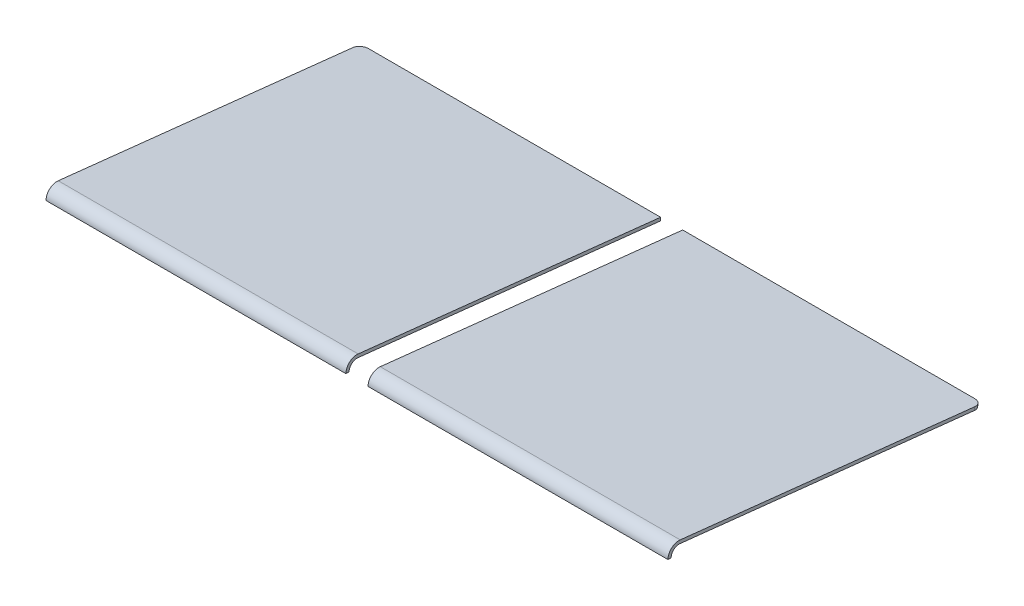
ISO-10303-21;
HEADER;
FILE_DESCRIPTION(('STEP AP214'),'2;1');
FILE_NAME('part.step','',(''),(''),'','','');
FILE_SCHEMA(('AUTOMOTIVE_DESIGN { 1 0 10303 214 1 1 1 1 }'));
ENDSEC;
DATA;
#1=APPLICATION_CONTEXT('core data for automotive mechanical design processes');
#2=APPLICATION_PROTOCOL_DEFINITION('international standard','automotive_design',2000,#1);
#3=PRODUCT_CONTEXT('',#1,'mechanical');
#4=PRODUCT('Part','Part','',(#3));
#5=PRODUCT_RELATED_PRODUCT_CATEGORY('part','',(#4));
#6=PRODUCT_DEFINITION_FORMATION('','',#4);
#7=PRODUCT_DEFINITION_CONTEXT('part definition',#1,'design');
#8=PRODUCT_DEFINITION('design','',#6,#7);
#9=PRODUCT_DEFINITION_SHAPE('','',#8);
#10=(LENGTH_UNIT() NAMED_UNIT(*) SI_UNIT(.MILLI.,.METRE.));
#11=(NAMED_UNIT(*) PLANE_ANGLE_UNIT() SI_UNIT($,.RADIAN.));
#12=(NAMED_UNIT(*) SI_UNIT($,.STERADIAN.) SOLID_ANGLE_UNIT());
#13=UNCERTAINTY_MEASURE_WITH_UNIT(LENGTH_MEASURE(1.E-05),#10,'distance_accuracy_value','');
#14=(GEOMETRIC_REPRESENTATION_CONTEXT(3) GLOBAL_UNCERTAINTY_ASSIGNED_CONTEXT((#13)) GLOBAL_UNIT_ASSIGNED_CONTEXT((#10,
#11,#12)) REPRESENTATION_CONTEXT('',''));
#15=CARTESIAN_POINT('',(0.,0.,0.));
#16=DIRECTION('',(0.,0.,1.));
#17=DIRECTION('',(1.,0.,0.));
#18=AXIS2_PLACEMENT_3D('',#15,#16,#17);
#19=CARTESIAN_POINT('',(362.,0.,0.));
#20=DIRECTION('',(1.,0.,0.));
#21=DIRECTION('',(0.,0.,-1.));
#22=AXIS2_PLACEMENT_3D('',#19,#20,#21);
#23=PLANE('',#22);
#24=DIRECTION('',(0.,0.,-1.));
#25=VECTOR('',#24,1.);
#26=CARTESIAN_POINT('',(362.,113.937005826671,37.4));
#27=LINE('',#26,#25);
#28=CARTESIAN_POINT('',(362.,113.937005826671,39.4));
#29=VERTEX_POINT('',#28);
#30=CARTESIAN_POINT('',(362.,113.937005826671,37.4));
#31=VERTEX_POINT('',#30);
#32=EDGE_CURVE('E162',#29,#31,#27,.T.);
#33=ORIENTED_EDGE('',*,*,#32,.T.);
#34=CARTESIAN_POINT('',(362.,113.937005826671,32.4));
#35=DIRECTION('',(1.,0.,0.));
#36=DIRECTION('',(0.,0.,-1.));
#37=AXIS2_PLACEMENT_3D('',#34,#35,#36);
#38=CIRCLE('',#37,5.00000000000001);
#39=CARTESIAN_POINT('',(362.,118.907830843486,31.8606497870554));
#40=VERTEX_POINT('',#39);
#41=EDGE_CURVE('E159',#40,#31,#38,.T.);
#42=ORIENTED_EDGE('',*,*,#41,.F.);
#43=DIRECTION('',(0.,0.107870042588919,0.994165003363056));
#44=VECTOR('',#43,1.);
#45=CARTESIAN_POINT('',(362.,100.,-142.4));
#46=LINE('',#45,#44);
#47=CARTESIAN_POINT('',(362.,98.6622549779722,-154.729088340045));
#48=VERTEX_POINT('',#47);
#49=EDGE_CURVE('E127',#48,#40,#46,.T.);
#50=ORIENTED_EDGE('',*,*,#49,.F.);
#51=DIRECTION('',(0.,-0.994165003363056,0.107870042588914));
#52=VECTOR('',#51,1.);
#53=CARTESIAN_POINT('',(362.,-15.4452148796673,-142.348067491777));
#54=LINE('',#53,#52);
#55=CARTESIAN_POINT('',(362.,100.650584984698,-154.944828425223));
#56=VERTEX_POINT('',#55);
#57=EDGE_CURVE('E123',#48,#56,#54,.F.);
#58=ORIENTED_EDGE('',*,*,#57,.T.);
#59=DIRECTION('',(0.,-0.107870042588919,-0.994165003363056));
#60=VECTOR('',#59,1.);
#61=CARTESIAN_POINT('',(362.,101.988330006726,-142.615740085178));
#62=LINE('',#61,#60);
#63=CARTESIAN_POINT('',(362.,120.896160850212,31.6449097018776));
#64=VERTEX_POINT('',#63);
#65=EDGE_CURVE('E148',#64,#56,#62,.T.);
#66=ORIENTED_EDGE('',*,*,#65,.F.);
#67=CARTESIAN_POINT('',(362.,113.937005826671,32.4));
#68=DIRECTION('',(1.,0.,0.));
#69=DIRECTION('',(0.,0.,-1.));
#70=AXIS2_PLACEMENT_3D('',#67,#68,#69);
#71=CIRCLE('',#70,7.00000000000001);
#72=EDGE_CURVE('E149',#29,#64,#71,.F.);
#73=ORIENTED_EDGE('',*,*,#72,.F.);
#74=EDGE_LOOP('',(#33,#42,#50,#58,#66,#73));
#75=FACE_BOUND('',#74,.T.);
#76=ADVANCED_FACE('F56',(#75),#23,.T.);
#77=CARTESIAN_POINT('',(853.368633251326,113.937005826671,32.4));
#78=DIRECTION('',(-1.,0.,0.));
#79=DIRECTION('',(0.,0.,1.));
#80=AXIS2_PLACEMENT_3D('',#77,#78,#79);
#81=CYLINDRICAL_SURFACE('',#80,5.00000000000001);
#82=CARTESIAN_POINT('',(172.,113.937005826671,32.4));
#83=DIRECTION('',(1.,0.,0.));
#84=DIRECTION('',(0.,0.,-1.));
#85=AXIS2_PLACEMENT_3D('',#82,#83,#84);
#86=CIRCLE('',#85,5.00000000000001);
#87=CARTESIAN_POINT('',(172.,118.907830843486,31.8606497870554));
#88=VERTEX_POINT('',#87);
#89=CARTESIAN_POINT('',(172.,113.937005826671,37.4));
#90=VERTEX_POINT('',#89);
#91=EDGE_CURVE('E90',#88,#90,#86,.T.);
#92=ORIENTED_EDGE('',*,*,#91,.F.);
#93=DIRECTION('',(-1.,0.,0.));
#94=VECTOR('',#93,1.);
#95=CARTESIAN_POINT('',(853.368633251326,118.907830843486,31.8606497870554));
#96=LINE('',#95,#94);
#97=EDGE_CURVE('E143',#40,#88,#96,.T.);
#98=ORIENTED_EDGE('',*,*,#97,.F.);
#99=ORIENTED_EDGE('',*,*,#41,.T.);
#100=DIRECTION('',(-1.,0.,0.));
#101=VECTOR('',#100,1.);
#102=CARTESIAN_POINT('',(853.368633251326,113.937005826671,37.4));
#103=LINE('',#102,#101);
#104=EDGE_CURVE('E60',#31,#90,#103,.T.);
#105=ORIENTED_EDGE('',*,*,#104,.T.);
#106=EDGE_LOOP('',(#92,#98,#99,#105));
#107=FACE_BOUND('',#106,.T.);
#108=ADVANCED_FACE('F58',(#107),#81,.F.);
#109=CARTESIAN_POINT('',(853.368633251326,113.937005826671,32.4));
#110=DIRECTION('',(-1.,0.,0.));
#111=DIRECTION('',(0.,0.,1.));
#112=AXIS2_PLACEMENT_3D('',#109,#110,#111);
#113=CYLINDRICAL_SURFACE('',#112,7.00000000000001);
#114=CARTESIAN_POINT('',(172.,113.937005826671,32.4));
#115=DIRECTION('',(1.,0.,0.));
#116=DIRECTION('',(0.,0.,-1.));
#117=AXIS2_PLACEMENT_3D('',#114,#115,#116);
#118=CIRCLE('',#117,7.00000000000001);
#119=CARTESIAN_POINT('',(172.,113.937005826671,39.4));
#120=VERTEX_POINT('',#119);
#121=CARTESIAN_POINT('',(172.,120.896160850212,31.6449097018776));
#122=VERTEX_POINT('',#121);
#123=EDGE_CURVE('E66',#120,#122,#118,.F.);
#124=ORIENTED_EDGE('',*,*,#123,.F.);
#125=DIRECTION('',(-1.,0.,0.));
#126=VECTOR('',#125,1.);
#127=CARTESIAN_POINT('',(853.368633251326,113.937005826671,39.4));
#128=LINE('',#127,#126);
#129=EDGE_CURVE('E168',#29,#120,#128,.T.);
#130=ORIENTED_EDGE('',*,*,#129,.F.);
#131=ORIENTED_EDGE('',*,*,#72,.T.);
#132=DIRECTION('',(-1.,0.,0.));
#133=VECTOR('',#132,1.);
#134=CARTESIAN_POINT('',(853.368633251326,120.896160850212,31.6449097018776));
#135=LINE('',#134,#133);
#136=EDGE_CURVE('E146',#64,#122,#135,.T.);
#137=ORIENTED_EDGE('',*,*,#136,.T.);
#138=EDGE_LOOP('',(#124,#130,#131,#137));
#139=FACE_BOUND('',#138,.T.);
#140=ADVANCED_FACE('F196',(#139),#113,.T.);
#141=CARTESIAN_POINT('',(853.368633251326,101.988330006726,-142.615740085178));
#142=DIRECTION('',(0.,0.994165003363056,-0.107870042588919));
#143=DIRECTION('',(0.,0.107870042588919,0.994165003363056));
#144=AXIS2_PLACEMENT_3D('',#141,#142,#143);
#145=PLANE('',#144);
#146=DIRECTION('',(0.,-0.107870042588919,-0.994165003363056));
#147=VECTOR('',#146,1.);
#148=CARTESIAN_POINT('',(172.,116.095799864366,-12.5967609334469));
#149=LINE('',#148,#147);
#150=CARTESIAN_POINT('',(172.,100.111234771754,-159.915653442038));
#151=VERTEX_POINT('',#150);
#152=EDGE_CURVE('E12',#122,#151,#149,.T.);
#153=ORIENTED_EDGE('',*,*,#152,.F.);
#154=ORIENTED_EDGE('',*,*,#136,.F.);
#155=ORIENTED_EDGE('',*,*,#65,.T.);
#156=CARTESIAN_POINT('',(357.,100.650584984698,-154.944828425223));
#157=DIRECTION('',(0.,0.994165003363056,-0.107870042588919));
#158=DIRECTION('',(0.,0.107870042588919,0.994165003363056));
#159=AXIS2_PLACEMENT_3D('',#156,#157,#158);
#160=CIRCLE('',#159,5.);
#161=CARTESIAN_POINT('',(357.,100.111234771754,-159.915653442038));
#162=VERTEX_POINT('',#161);
#163=EDGE_CURVE('E145',#56,#162,#160,.T.);
#164=ORIENTED_EDGE('',*,*,#163,.T.);
#165=DIRECTION('',(-1.,0.,0.));
#166=VECTOR('',#165,1.);
#167=CARTESIAN_POINT('',(853.368633251326,100.111234771754,-159.915653442038));
#168=LINE('',#167,#166);
#169=EDGE_CURVE('E135',#162,#151,#168,.T.);
#170=ORIENTED_EDGE('',*,*,#169,.T.);
#171=EDGE_LOOP('',(#153,#154,#155,#164,#170));
#172=FACE_BOUND('',#171,.T.);
#173=ADVANCED_FACE('F201',(#172),#145,.T.);
#174=CARTESIAN_POINT('',(853.368633251326,100.111234771754,-159.915653442038));
#175=DIRECTION('',(0.,-0.107870042588914,-0.994165003363056));
#176=DIRECTION('',(0.,0.994165003363056,-0.107870042588914));
#177=AXIS2_PLACEMENT_3D('',#174,#175,#176);
#178=PLANE('',#177);
#179=DIRECTION('',(0.,0.994165003363056,-0.107870042588919));
#180=VECTOR('',#179,1.);
#181=CARTESIAN_POINT('',(172.,76.7713063651824,-157.383197498887));
#182=LINE('',#181,#180);
#183=CARTESIAN_POINT('',(172.,98.1229047650276,-159.69991335686));
#184=VERTEX_POINT('',#183);
#185=EDGE_CURVE('E73',#184,#151,#182,.T.);
#186=ORIENTED_EDGE('',*,*,#185,.T.);
#187=ORIENTED_EDGE('',*,*,#169,.F.);
#188=DIRECTION('',(0.,-0.994165003363056,0.107870042588914));
#189=VECTOR('',#188,1.);
#190=CARTESIAN_POINT('',(357.,100.111234771754,-159.915653442038));
#191=LINE('',#190,#189);
#192=CARTESIAN_POINT('',(357.,98.1229047650276,-159.69991335686));
#193=VERTEX_POINT('',#192);
#194=EDGE_CURVE('E122',#162,#193,#191,.T.);
#195=ORIENTED_EDGE('',*,*,#194,.T.);
#196=DIRECTION('',(-1.,0.,0.));
#197=VECTOR('',#196,1.);
#198=CARTESIAN_POINT('',(853.368633251326,98.1229047650276,-159.69991335686));
#199=LINE('',#198,#197);
#200=EDGE_CURVE('E128',#193,#184,#199,.T.);
#201=ORIENTED_EDGE('',*,*,#200,.T.);
#202=EDGE_LOOP('',(#186,#187,#195,#201));
#203=FACE_BOUND('',#202,.T.);
#204=ADVANCED_FACE('F133',(#203),#178,.T.);
#205=CARTESIAN_POINT('',(853.368633251326,100.,-142.4));
#206=DIRECTION('',(0.,-0.994165003363056,0.107870042588919));
#207=DIRECTION('',(0.,-0.107870042588919,-0.994165003363056));
#208=AXIS2_PLACEMENT_3D('',#205,#206,#207);
#209=PLANE('',#208);
#210=DIRECTION('',(0.,0.107870042588919,0.994165003363056));
#211=VECTOR('',#210,1.);
#212=CARTESIAN_POINT('',(172.,100.,-142.4));
#213=LINE('',#212,#211);
#214=EDGE_CURVE('E139',#184,#88,#213,.T.);
#215=ORIENTED_EDGE('',*,*,#214,.F.);
#216=ORIENTED_EDGE('',*,*,#200,.F.);
#217=CARTESIAN_POINT('',(357.,98.6622549779722,-154.729088340045));
#218=DIRECTION('',(0.,-0.994165003363056,0.107870042588919));
#219=DIRECTION('',(0.,-0.107870042588919,-0.994165003363056));
#220=AXIS2_PLACEMENT_3D('',#217,#218,#219);
#221=CIRCLE('',#220,5.);
#222=EDGE_CURVE('E118',#193,#48,#221,.T.);
#223=ORIENTED_EDGE('',*,*,#222,.T.);
#224=ORIENTED_EDGE('',*,*,#49,.T.);
#225=ORIENTED_EDGE('',*,*,#97,.T.);
#226=EDGE_LOOP('',(#215,#216,#223,#224,#225));
#227=FACE_BOUND('',#226,.T.);
#228=ADVANCED_FACE('F137',(#227),#209,.T.);
#229=CARTESIAN_POINT('',(357.,100.650584984698,-154.944828425223));
#230=DIRECTION('',(0.,-0.994165003363056,0.107870042588914));
#231=DIRECTION('',(0.,-0.107870042588914,-0.994165003363056));
#232=AXIS2_PLACEMENT_3D('',#229,#230,#231);
#233=CYLINDRICAL_SURFACE('',#232,5.);
#234=ORIENTED_EDGE('',*,*,#163,.F.);
#235=ORIENTED_EDGE('',*,*,#57,.F.);
#236=ORIENTED_EDGE('',*,*,#222,.F.);
#237=ORIENTED_EDGE('',*,*,#194,.F.);
#238=EDGE_LOOP('',(#234,#235,#236,#237));
#239=FACE_BOUND('',#238,.T.);
#240=ADVANCED_FACE('F121',(#239),#233,.T.);
#241=CARTESIAN_POINT('',(364.061552812809,113.937005826671,37.4));
#242=DIRECTION('',(0.,1.,0.));
#243=DIRECTION('',(0.,0.,1.));
#244=AXIS2_PLACEMENT_3D('',#241,#242,#243);
#245=PLANE('',#244);
#246=ORIENTED_EDGE('',*,*,#129,.T.);
#247=DIRECTION('',(0.,0.,-1.));
#248=VECTOR('',#247,1.);
#249=CARTESIAN_POINT('',(172.,113.937005826671,37.4));
#250=LINE('',#249,#248);
#251=EDGE_CURVE('E86',#120,#90,#250,.T.);
#252=ORIENTED_EDGE('',*,*,#251,.T.);
#253=ORIENTED_EDGE('',*,*,#104,.F.);
#254=ORIENTED_EDGE('',*,*,#32,.F.);
#255=EDGE_LOOP('',(#246,#252,#253,#254));
#256=FACE_BOUND('',#255,.T.);
#257=ADVANCED_FACE('F180',(#256),#245,.F.);
#258=CARTESIAN_POINT('',(172.,92.755871457795,-10.0643049902962));
#259=DIRECTION('',(1.,0.,0.));
#260=DIRECTION('',(0.,0.,-1.));
#261=AXIS2_PLACEMENT_3D('',#258,#259,#260);
#262=PLANE('',#261);
#263=ORIENTED_EDGE('',*,*,#214,.T.);
#264=ORIENTED_EDGE('',*,*,#91,.T.);
#265=ORIENTED_EDGE('',*,*,#251,.F.);
#266=ORIENTED_EDGE('',*,*,#123,.T.);
#267=ORIENTED_EDGE('',*,*,#152,.T.);
#268=ORIENTED_EDGE('',*,*,#185,.F.);
#269=EDGE_LOOP('',(#263,#264,#265,#266,#267,#268));
#270=FACE_BOUND('',#269,.T.);
#271=ADVANCED_FACE('F182',(#270),#262,.F.);
#272=CLOSED_SHELL('',(#76,#108,#140,#173,#204,#228,#240,#257,#271));
#273=MANIFOLD_SOLID_BREP('B2',#272);
#274=CARTESIAN_POINT('',(-27.,93.6914299611579,-154.1897381271));
#275=DIRECTION('',(0.,-0.994165003363056,0.107870042588914));
#276=DIRECTION('',(0.,-0.107870042588914,-0.994165003363056));
#277=AXIS2_PLACEMENT_3D('',#274,#275,#276);
#278=CYLINDRICAL_SURFACE('',#277,5.);
#279=CARTESIAN_POINT('',(-27.,100.650584984698,-154.944828425223));
#280=DIRECTION('',(0.,0.994165003363056,-0.107870042588919));
#281=DIRECTION('',(0.,0.107870042588919,0.994165003363056));
#282=AXIS2_PLACEMENT_3D('',#279,#280,#281);
#283=CIRCLE('',#282,5.);
#284=CARTESIAN_POINT('',(-26.9999999999998,100.111234771754,-159.915653442038));
#285=VERTEX_POINT('',#284);
#286=CARTESIAN_POINT('',(-32.,100.650584984698,-154.944828425223));
#287=VERTEX_POINT('',#286);
#288=EDGE_CURVE('E361',#285,#287,#283,.T.);
#289=ORIENTED_EDGE('',*,*,#288,.F.);
#290=DIRECTION('',(0.,-0.994165003363056,0.107870042588914));
#291=VECTOR('',#290,1.);
#292=CARTESIAN_POINT('',(-27.,100.111234771754,-159.915653442038));
#293=LINE('',#292,#291);
#294=CARTESIAN_POINT('',(-26.9999999999998,98.1229047650276,-159.69991335686));
#295=VERTEX_POINT('',#294);
#296=EDGE_CURVE('E359',#295,#285,#293,.F.);
#297=ORIENTED_EDGE('',*,*,#296,.F.);
#298=CARTESIAN_POINT('',(-27.,98.6622549779722,-154.729088340045));
#299=DIRECTION('',(0.,-0.994165003363056,0.107870042588919));
#300=DIRECTION('',(0.,-0.107870042588919,-0.994165003363056));
#301=AXIS2_PLACEMENT_3D('',#298,#299,#300);
#302=CIRCLE('',#301,5.);
#303=CARTESIAN_POINT('',(-32.,98.6622549779722,-154.729088340045));
#304=VERTEX_POINT('',#303);
#305=EDGE_CURVE('E384',#304,#295,#302,.T.);
#306=ORIENTED_EDGE('',*,*,#305,.F.);
#307=DIRECTION('',(0.,-0.994165003363056,0.107870042588914));
#308=VECTOR('',#307,1.);
#309=CARTESIAN_POINT('',(-32.,93.6914299611579,-154.1897381271));
#310=LINE('',#309,#308);
#311=EDGE_CURVE('E379',#287,#304,#310,.T.);
#312=ORIENTED_EDGE('',*,*,#311,.F.);
#313=EDGE_LOOP('',(#289,#297,#306,#312));
#314=FACE_BOUND('',#313,.T.);
#315=ADVANCED_FACE('F281',(#314),#278,.T.);
#316=CARTESIAN_POINT('',(-32.,113.937005826671,32.4));
#317=DIRECTION('',(-1.,0.,0.));
#318=DIRECTION('',(0.,0.,1.));
#319=AXIS2_PLACEMENT_3D('',#316,#317,#318);
#320=PLANE('',#319);
#321=DIRECTION('',(0.,0.,-1.));
#322=VECTOR('',#321,1.);
#323=CARTESIAN_POINT('',(-32.,113.937005826671,37.4));
#324=LINE('',#323,#322);
#325=CARTESIAN_POINT('',(-32.,113.937005826671,39.4));
#326=VERTEX_POINT('',#325);
#327=CARTESIAN_POINT('',(-32.,113.937005826671,37.4));
#328=VERTEX_POINT('',#327);
#329=EDGE_CURVE('E289',#326,#328,#324,.T.);
#330=ORIENTED_EDGE('',*,*,#329,.F.);
#331=CARTESIAN_POINT('',(-32.,113.937005826671,32.4));
#332=DIRECTION('',(-1.,0.,0.));
#333=DIRECTION('',(0.,0.,1.));
#334=AXIS2_PLACEMENT_3D('',#331,#332,#333);
#335=CIRCLE('',#334,7.00000000000001);
#336=CARTESIAN_POINT('',(-32.,120.896160850212,31.6449097018776));
#337=VERTEX_POINT('',#336);
#338=EDGE_CURVE('E373',#326,#337,#335,.T.);
#339=ORIENTED_EDGE('',*,*,#338,.T.);
#340=DIRECTION('',(0.,-0.107870042588919,-0.994165003363056));
#341=VECTOR('',#340,1.);
#342=CARTESIAN_POINT('',(-32.,101.988330006726,-142.615740085178));
#343=LINE('',#342,#341);
#344=EDGE_CURVE('E376',#337,#287,#343,.T.);
#345=ORIENTED_EDGE('',*,*,#344,.T.);
#346=ORIENTED_EDGE('',*,*,#311,.T.);
#347=DIRECTION('',(0.,0.107870042588919,0.994165003363056));
#348=VECTOR('',#347,1.);
#349=CARTESIAN_POINT('',(-32.,100.,-142.4));
#350=LINE('',#349,#348);
#351=CARTESIAN_POINT('',(-32.,118.907830843486,31.8606497870554));
#352=VERTEX_POINT('',#351);
#353=EDGE_CURVE('E372',#304,#352,#350,.T.);
#354=ORIENTED_EDGE('',*,*,#353,.T.);
#355=CARTESIAN_POINT('',(-32.,113.937005826671,32.4));
#356=DIRECTION('',(1.,0.,0.));
#357=DIRECTION('',(0.,0.,1.));
#358=AXIS2_PLACEMENT_3D('',#355,#356,#357);
#359=CIRCLE('',#358,5.00000000000001);
#360=EDGE_CURVE('E369',#352,#328,#359,.T.);
#361=ORIENTED_EDGE('',*,*,#360,.T.);
#362=EDGE_LOOP('',(#330,#339,#345,#346,#354,#361));
#363=FACE_BOUND('',#362,.T.);
#364=ADVANCED_FACE('F283',(#363),#320,.T.);
#365=CARTESIAN_POINT('',(853.368633251326,100.,-142.4));
#366=DIRECTION('',(0.,-0.994165003363056,0.107870042588919));
#367=DIRECTION('',(0.,-0.107870042588919,-0.994165003363056));
#368=AXIS2_PLACEMENT_3D('',#365,#366,#367);
#369=PLANE('',#368);
#370=DIRECTION('',(-1.,0.,0.));
#371=VECTOR('',#370,1.);
#372=CARTESIAN_POINT('',(853.368633251326,98.1229047650276,-159.69991335686));
#373=LINE('',#372,#371);
#374=CARTESIAN_POINT('',(158.,98.1229047650276,-159.69991335686));
#375=VERTEX_POINT('',#374);
#376=EDGE_CURVE('E363',#375,#295,#373,.T.);
#377=ORIENTED_EDGE('',*,*,#376,.F.);
#378=DIRECTION('',(0.,0.107870042588919,0.994165003363056));
#379=VECTOR('',#378,1.);
#380=CARTESIAN_POINT('',(158.,100.,-142.4));
#381=LINE('',#380,#379);
#382=CARTESIAN_POINT('',(158.,118.907830843486,31.8606497870554));
#383=VERTEX_POINT('',#382);
#384=EDGE_CURVE('E344',#375,#383,#381,.T.);
#385=ORIENTED_EDGE('',*,*,#384,.T.);
#386=DIRECTION('',(-1.,0.,0.));
#387=VECTOR('',#386,1.);
#388=CARTESIAN_POINT('',(853.368633251326,118.907830843486,31.8606497870554));
#389=LINE('',#388,#387);
#390=EDGE_CURVE('E387',#383,#352,#389,.T.);
#391=ORIENTED_EDGE('',*,*,#390,.T.);
#392=ORIENTED_EDGE('',*,*,#353,.F.);
#393=ORIENTED_EDGE('',*,*,#305,.T.);
#394=EDGE_LOOP('',(#377,#385,#391,#392,#393));
#395=FACE_BOUND('',#394,.T.);
#396=ADVANCED_FACE('F407',(#395),#369,.T.);
#397=CARTESIAN_POINT('',(853.368633251326,100.111234771754,-159.915653442038));
#398=DIRECTION('',(0.,-0.107870042588914,-0.994165003363056));
#399=DIRECTION('',(0.,0.994165003363056,-0.107870042588914));
#400=AXIS2_PLACEMENT_3D('',#397,#398,#399);
#401=PLANE('',#400);
#402=DIRECTION('',(-1.,0.,0.));
#403=VECTOR('',#402,1.);
#404=CARTESIAN_POINT('',(853.368633251326,100.111234771754,-159.915653442038));
#405=LINE('',#404,#403);
#406=CARTESIAN_POINT('',(158.,100.111234771754,-159.915653442038));
#407=VERTEX_POINT('',#406);
#408=EDGE_CURVE('E352',#407,#285,#405,.T.);
#409=ORIENTED_EDGE('',*,*,#408,.F.);
#410=DIRECTION('',(0.,0.994165003363056,-0.107870042588919));
#411=VECTOR('',#410,1.);
#412=CARTESIAN_POINT('',(158.,76.7713063651824,-157.383197498887));
#413=LINE('',#412,#411);
#414=EDGE_CURVE('E339',#375,#407,#413,.T.);
#415=ORIENTED_EDGE('',*,*,#414,.F.);
#416=ORIENTED_EDGE('',*,*,#376,.T.);
#417=ORIENTED_EDGE('',*,*,#296,.T.);
#418=EDGE_LOOP('',(#409,#415,#416,#417));
#419=FACE_BOUND('',#418,.T.);
#420=ADVANCED_FACE('F357',(#419),#401,.T.);
#421=CARTESIAN_POINT('',(853.368633251326,101.988330006726,-142.615740085178));
#422=DIRECTION('',(0.,0.994165003363056,-0.107870042588919));
#423=DIRECTION('',(0.,0.107870042588919,0.994165003363056));
#424=AXIS2_PLACEMENT_3D('',#421,#422,#423);
#425=PLANE('',#424);
#426=DIRECTION('',(-1.,0.,0.));
#427=VECTOR('',#426,1.);
#428=CARTESIAN_POINT('',(853.368633251326,120.896160850212,31.6449097018776));
#429=LINE('',#428,#427);
#430=CARTESIAN_POINT('',(158.,120.896160850212,31.6449097018776));
#431=VERTEX_POINT('',#430);
#432=EDGE_CURVE('E355',#431,#337,#429,.T.);
#433=ORIENTED_EDGE('',*,*,#432,.F.);
#434=DIRECTION('',(0.,-0.107870042588919,-0.994165003363056));
#435=VECTOR('',#434,1.);
#436=CARTESIAN_POINT('',(158.,116.095799864366,-12.5967609334469));
#437=LINE('',#436,#435);
#438=EDGE_CURVE('E342',#431,#407,#437,.T.);
#439=ORIENTED_EDGE('',*,*,#438,.T.);
#440=ORIENTED_EDGE('',*,*,#408,.T.);
#441=ORIENTED_EDGE('',*,*,#288,.T.);
#442=ORIENTED_EDGE('',*,*,#344,.F.);
#443=EDGE_LOOP('',(#433,#439,#440,#441,#442));
#444=FACE_BOUND('',#443,.T.);
#445=ADVANCED_FACE('F351',(#444),#425,.T.);
#446=CARTESIAN_POINT('',(364.061552812809,113.937005826671,37.4));
#447=DIRECTION('',(0.,1.,0.));
#448=DIRECTION('',(0.,0.,1.));
#449=AXIS2_PLACEMENT_3D('',#446,#447,#448);
#450=PLANE('',#449);
#451=DIRECTION('',(0.,0.,-1.));
#452=VECTOR('',#451,1.);
#453=CARTESIAN_POINT('',(158.,113.937005826671,37.4));
#454=LINE('',#453,#452);
#455=CARTESIAN_POINT('',(158.,113.937005826671,39.4));
#456=VERTEX_POINT('',#455);
#457=CARTESIAN_POINT('',(158.,113.937005826671,37.4));
#458=VERTEX_POINT('',#457);
#459=EDGE_CURVE('E54',#456,#458,#454,.T.);
#460=ORIENTED_EDGE('',*,*,#459,.F.);
#461=DIRECTION('',(-1.,0.,0.));
#462=VECTOR('',#461,1.);
#463=CARTESIAN_POINT('',(853.368633251326,113.937005826671,39.4));
#464=LINE('',#463,#462);
#465=EDGE_CURVE('E381',#456,#326,#464,.T.);
#466=ORIENTED_EDGE('',*,*,#465,.T.);
#467=ORIENTED_EDGE('',*,*,#329,.T.);
#468=DIRECTION('',(-1.,0.,0.));
#469=VECTOR('',#468,1.);
#470=CARTESIAN_POINT('',(853.368633251326,113.937005826671,37.4));
#471=LINE('',#470,#469);
#472=EDGE_CURVE('E303',#458,#328,#471,.T.);
#473=ORIENTED_EDGE('',*,*,#472,.F.);
#474=EDGE_LOOP('',(#460,#466,#467,#473));
#475=FACE_BOUND('',#474,.T.);
#476=ADVANCED_FACE('F422',(#475),#450,.F.);
#477=CARTESIAN_POINT('',(853.368633251326,113.937005826671,32.4));
#478=DIRECTION('',(-1.,0.,0.));
#479=DIRECTION('',(0.,0.,1.));
#480=AXIS2_PLACEMENT_3D('',#477,#478,#479);
#481=CYLINDRICAL_SURFACE('',#480,7.00000000000001);
#482=ORIENTED_EDGE('',*,*,#465,.F.);
#483=CARTESIAN_POINT('',(158.,113.937005826671,32.4));
#484=DIRECTION('',(1.,0.,0.));
#485=DIRECTION('',(0.,0.,-1.));
#486=AXIS2_PLACEMENT_3D('',#483,#484,#485);
#487=CIRCLE('',#486,7.00000000000001);
#488=EDGE_CURVE('E295',#456,#431,#487,.F.);
#489=ORIENTED_EDGE('',*,*,#488,.T.);
#490=ORIENTED_EDGE('',*,*,#432,.T.);
#491=ORIENTED_EDGE('',*,*,#338,.F.);
#492=EDGE_LOOP('',(#482,#489,#490,#491));
#493=FACE_BOUND('',#492,.T.);
#494=ADVANCED_FACE('F399',(#493),#481,.T.);
#495=CARTESIAN_POINT('',(853.368633251326,113.937005826671,32.4));
#496=DIRECTION('',(-1.,0.,0.));
#497=DIRECTION('',(0.,0.,1.));
#498=AXIS2_PLACEMENT_3D('',#495,#496,#497);
#499=CYLINDRICAL_SURFACE('',#498,5.00000000000001);
#500=ORIENTED_EDGE('',*,*,#390,.F.);
#501=CARTESIAN_POINT('',(158.,113.937005826671,32.4));
#502=DIRECTION('',(1.,0.,0.));
#503=DIRECTION('',(0.,0.,-1.));
#504=AXIS2_PLACEMENT_3D('',#501,#502,#503);
#505=CIRCLE('',#504,5.00000000000001);
#506=EDGE_CURVE('E396',#383,#458,#505,.T.);
#507=ORIENTED_EDGE('',*,*,#506,.T.);
#508=ORIENTED_EDGE('',*,*,#472,.T.);
#509=ORIENTED_EDGE('',*,*,#360,.F.);
#510=EDGE_LOOP('',(#500,#507,#508,#509));
#511=FACE_BOUND('',#510,.T.);
#512=ADVANCED_FACE('F405',(#511),#499,.F.);
#513=CARTESIAN_POINT('',(158.,92.755871457795,-10.0643049902962));
#514=DIRECTION('',(1.,0.,0.));
#515=DIRECTION('',(0.,0.,-1.));
#516=AXIS2_PLACEMENT_3D('',#513,#514,#515);
#517=PLANE('',#516);
#518=ORIENTED_EDGE('',*,*,#414,.T.);
#519=ORIENTED_EDGE('',*,*,#438,.F.);
#520=ORIENTED_EDGE('',*,*,#488,.F.);
#521=ORIENTED_EDGE('',*,*,#459,.T.);
#522=ORIENTED_EDGE('',*,*,#506,.F.);
#523=ORIENTED_EDGE('',*,*,#384,.F.);
#524=EDGE_LOOP('',(#518,#519,#520,#521,#522,#523));
#525=FACE_BOUND('',#524,.T.);
#526=ADVANCED_FACE('F341',(#525),#517,.T.);
#527=CLOSED_SHELL('',(#315,#364,#396,#420,#445,#476,#494,#512,#526));
#528=MANIFOLD_SOLID_BREP('B6',#527);
#529=ADVANCED_BREP_SHAPE_REPRESENTATION('',(#18,#273,#528),#14);
#530=SHAPE_DEFINITION_REPRESENTATION(#9,#529);
ENDSEC;
END-ISO-10303-21;
